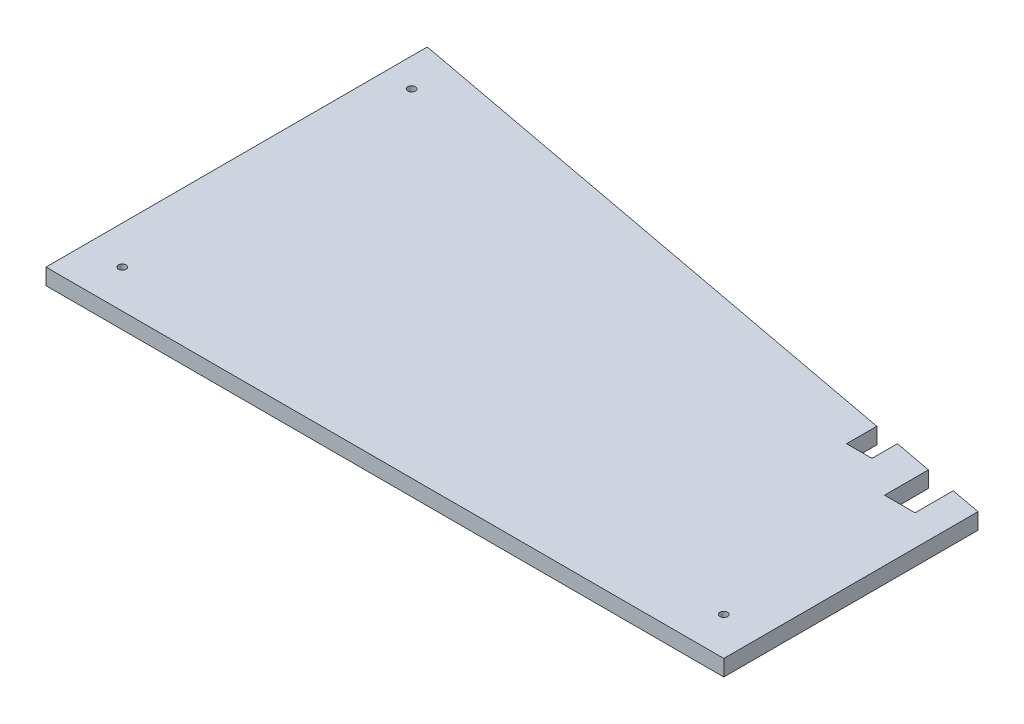
ISO-10303-21;
HEADER;
FILE_DESCRIPTION(('STEP AP214'),'2;1');
FILE_NAME('part.step','',(''),(''),'','','');
FILE_SCHEMA(('AUTOMOTIVE_DESIGN { 1 0 10303 214 1 1 1 1 }'));
ENDSEC;
DATA;
#1=APPLICATION_CONTEXT('core data for automotive mechanical design processes');
#2=APPLICATION_PROTOCOL_DEFINITION('international standard','automotive_design',2000,#1);
#3=PRODUCT_CONTEXT('',#1,'mechanical');
#4=PRODUCT('Part','Part','',(#3));
#5=PRODUCT_RELATED_PRODUCT_CATEGORY('part','',(#4));
#6=PRODUCT_DEFINITION_FORMATION('','',#4);
#7=PRODUCT_DEFINITION_CONTEXT('part definition',#1,'design');
#8=PRODUCT_DEFINITION('design','',#6,#7);
#9=PRODUCT_DEFINITION_SHAPE('','',#8);
#10=(LENGTH_UNIT() NAMED_UNIT(*) SI_UNIT(.MILLI.,.METRE.));
#11=(NAMED_UNIT(*) PLANE_ANGLE_UNIT() SI_UNIT($,.RADIAN.));
#12=(NAMED_UNIT(*) SI_UNIT($,.STERADIAN.) SOLID_ANGLE_UNIT());
#13=UNCERTAINTY_MEASURE_WITH_UNIT(LENGTH_MEASURE(1.E-05),#10,'distance_accuracy_value','');
#14=(GEOMETRIC_REPRESENTATION_CONTEXT(3) GLOBAL_UNCERTAINTY_ASSIGNED_CONTEXT((#13)) GLOBAL_UNIT_ASSIGNED_CONTEXT((#10,
#11,#12)) REPRESENTATION_CONTEXT('',''));
#15=CARTESIAN_POINT('',(0.,0.,0.));
#16=DIRECTION('',(0.,0.,1.));
#17=DIRECTION('',(1.,0.,0.));
#18=AXIS2_PLACEMENT_3D('',#15,#16,#17);
#19=CARTESIAN_POINT('',(0.,6.35,0.));
#20=DIRECTION('',(0.,1.,0.));
#21=DIRECTION('',(0.,0.,1.));
#22=AXIS2_PLACEMENT_3D('',#19,#20,#21);
#23=PLANE('',#22);
#24=CARTESIAN_POINT('',(15.,6.35,-15.));
#25=DIRECTION('',(0.,1.,0.));
#26=DIRECTION('',(0.,0.,1.));
#27=AXIS2_PLACEMENT_3D('',#24,#25,#26);
#28=CIRCLE('',#27,1.5);
#29=CARTESIAN_POINT('',(15.,6.35,-13.5));
#30=VERTEX_POINT('',#29);
#31=EDGE_CURVE('E327',#30,#30,#28,.T.);
#32=ORIENTED_EDGE('',*,*,#31,.F.);
#33=EDGE_LOOP('',(#32));
#34=FACE_BOUND('',#33,.T.);
#35=DIRECTION('',(0.,0.,1.));
#36=VECTOR('',#35,1.);
#37=CARTESIAN_POINT('',(0.,6.35,-150.));
#38=LINE('',#37,#36);
#39=CARTESIAN_POINT('',(0.,6.35,-150.));
#40=VERTEX_POINT('',#39);
#41=CARTESIAN_POINT('',(0.,6.35,0.));
#42=VERTEX_POINT('',#41);
#43=EDGE_CURVE('E200',#40,#42,#38,.T.);
#44=ORIENTED_EDGE('',*,*,#43,.T.);
#45=DIRECTION('',(1.,0.,0.));
#46=VECTOR('',#45,1.);
#47=CARTESIAN_POINT('',(0.,6.35,0.));
#48=LINE('',#47,#46);
#49=CARTESIAN_POINT('',(266.65,6.35,0.));
#50=VERTEX_POINT('',#49);
#51=EDGE_CURVE('E112',#42,#50,#48,.T.);
#52=ORIENTED_EDGE('',*,*,#51,.T.);
#53=DIRECTION('',(0.,0.,-1.));
#54=VECTOR('',#53,1.);
#55=CARTESIAN_POINT('',(266.65,6.35,0.));
#56=LINE('',#55,#54);
#57=CARTESIAN_POINT('',(266.65,6.35,-100.));
#58=VERTEX_POINT('',#57);
#59=EDGE_CURVE('E237',#50,#58,#56,.T.);
#60=ORIENTED_EDGE('',*,*,#59,.T.);
#61=DIRECTION('',(-0.982870100460058,0.,-0.184299662565171));
#62=VECTOR('',#61,1.);
#63=CARTESIAN_POINT('',(266.65,6.35,-100.));
#64=LINE('',#63,#62);
#65=CARTESIAN_POINT('',(254.65,6.35,-102.25014063379));
#66=VERTEX_POINT('',#65);
#67=EDGE_CURVE('E257',#58,#66,#64,.T.);
#68=ORIENTED_EDGE('',*,*,#67,.T.);
#69=DIRECTION('',(0.,0.,1.));
#70=VECTOR('',#69,1.);
#71=CARTESIAN_POINT('',(254.65,6.35,-87.2501406337896));
#72=LINE('',#71,#70);
#73=CARTESIAN_POINT('',(254.65,6.35,-87.2501406337896));
#74=VERTEX_POINT('',#73);
#75=EDGE_CURVE('E253',#66,#74,#72,.T.);
#76=ORIENTED_EDGE('',*,*,#75,.T.);
#77=DIRECTION('',(-0.999995760709284,0.,0.00291179729023164));
#78=VECTOR('',#77,1.);
#79=CARTESIAN_POINT('',(242.650050871489,6.35,-87.2151990663068));
#80=LINE('',#79,#78);
#81=CARTESIAN_POINT('',(242.650050871489,6.35,-87.2151990663068));
#82=VERTEX_POINT('',#81);
#83=EDGE_CURVE('E256',#74,#82,#80,.T.);
#84=ORIENTED_EDGE('',*,*,#83,.T.);
#85=DIRECTION('',(0.,0.,-1.));
#86=VECTOR('',#85,1.);
#87=CARTESIAN_POINT('',(242.650050871489,6.35,-104.500271728579));
#88=LINE('',#87,#86);
#89=CARTESIAN_POINT('',(242.650050871489,6.35,-104.500271728579));
#90=VERTEX_POINT('',#89);
#91=EDGE_CURVE('E261',#82,#90,#88,.T.);
#92=ORIENTED_EDGE('',*,*,#91,.T.);
#93=DIRECTION('',(-0.982870100460058,0.,-0.184299662565171));
#94=VECTOR('',#93,1.);
#95=CARTESIAN_POINT('',(242.650050871489,6.35,-104.500271728579));
#96=LINE('',#95,#94);
#97=CARTESIAN_POINT('',(227.650050871489,6.35,-107.312947520816));
#98=VERTEX_POINT('',#97);
#99=EDGE_CURVE('E268',#90,#98,#96,.T.);
#100=ORIENTED_EDGE('',*,*,#99,.T.);
#101=DIRECTION('',(0.,0.,1.));
#102=VECTOR('',#101,1.);
#103=CARTESIAN_POINT('',(227.650050871489,6.35,-97.3129475208159));
#104=LINE('',#103,#102);
#105=CARTESIAN_POINT('',(227.650050871489,6.35,-97.3129475208159));
#106=VERTEX_POINT('',#105);
#107=EDGE_CURVE('E143',#98,#106,#104,.T.);
#108=ORIENTED_EDGE('',*,*,#107,.T.);
#109=DIRECTION('',(-0.999995760709285,0.,0.00291179729023254));
#110=VECTOR('',#109,1.);
#111=CARTESIAN_POINT('',(227.650050871489,6.35,-97.3129475208159));
#112=LINE('',#111,#110);
#113=CARTESIAN_POINT('',(217.650050871489,6.35,-97.2838294244735));
#114=VERTEX_POINT('',#113);
#115=EDGE_CURVE('E137',#106,#114,#112,.T.);
#116=ORIENTED_EDGE('',*,*,#115,.T.);
#117=DIRECTION('',(0.,0.,-1.));
#118=VECTOR('',#117,1.);
#119=CARTESIAN_POINT('',(217.650050871489,6.35,-97.2838294244735));
#120=LINE('',#119,#118);
#121=CARTESIAN_POINT('',(217.650050871489,6.35,-109.188064715641));
#122=VERTEX_POINT('',#121);
#123=EDGE_CURVE('E141',#114,#122,#120,.T.);
#124=ORIENTED_EDGE('',*,*,#123,.T.);
#125=DIRECTION('',(-0.982870100460058,0.,-0.184299662565171));
#126=VECTOR('',#125,1.);
#127=CARTESIAN_POINT('',(217.650050871489,6.35,-109.188064715641));
#128=LINE('',#127,#126);
#129=EDGE_CURVE('E57',#122,#40,#128,.T.);
#130=ORIENTED_EDGE('',*,*,#129,.T.);
#131=EDGE_LOOP('',(#44,#52,#60,#68,#76,#84,#92,#100,#108,#116,#124,#130));
#132=FACE_BOUND('',#131,.T.);
#133=CARTESIAN_POINT('',(251.65,6.35,-15.));
#134=DIRECTION('',(0.,1.,0.));
#135=DIRECTION('',(0.,0.,1.));
#136=AXIS2_PLACEMENT_3D('',#133,#134,#135);
#137=CIRCLE('',#136,1.50000000000002);
#138=CARTESIAN_POINT('',(251.65,6.35,-13.5));
#139=VERTEX_POINT('',#138);
#140=EDGE_CURVE('E170',#139,#139,#137,.T.);
#141=ORIENTED_EDGE('',*,*,#140,.F.);
#142=EDGE_LOOP('',(#141));
#143=FACE_BOUND('',#142,.T.);
#144=CARTESIAN_POINT('',(11.1969277173947,6.35,-132.639018124475));
#145=DIRECTION('',(0.,1.,0.));
#146=DIRECTION('',(0.,0.,1.));
#147=AXIS2_PLACEMENT_3D('',#144,#145,#146);
#148=CIRCLE('',#147,1.5);
#149=CARTESIAN_POINT('',(11.1969277173947,6.35,-131.139018124475));
#150=VERTEX_POINT('',#149);
#151=EDGE_CURVE('E316',#150,#150,#148,.T.);
#152=ORIENTED_EDGE('',*,*,#151,.F.);
#153=EDGE_LOOP('',(#152));
#154=FACE_BOUND('',#153,.T.);
#155=ADVANCED_FACE('F39',(#34,#132,#143,#154),#23,.T.);
#156=CARTESIAN_POINT('',(0.,0.,0.));
#157=DIRECTION('',(0.,1.,0.));
#158=DIRECTION('',(0.,0.,1.));
#159=AXIS2_PLACEMENT_3D('',#156,#157,#158);
#160=PLANE('',#159);
#161=DIRECTION('',(0.,0.,1.));
#162=VECTOR('',#161,1.);
#163=CARTESIAN_POINT('',(0.,0.,-150.));
#164=LINE('',#163,#162);
#165=CARTESIAN_POINT('',(0.,0.,-150.));
#166=VERTEX_POINT('',#165);
#167=CARTESIAN_POINT('',(0.,0.,0.));
#168=VERTEX_POINT('',#167);
#169=EDGE_CURVE('E165',#166,#168,#164,.T.);
#170=ORIENTED_EDGE('',*,*,#169,.F.);
#171=DIRECTION('',(-0.982870100460058,0.,-0.184299662565171));
#172=VECTOR('',#171,1.);
#173=CARTESIAN_POINT('',(217.650050871489,0.,-109.188064715641));
#174=LINE('',#173,#172);
#175=CARTESIAN_POINT('',(217.650050871489,0.,-109.188064715641));
#176=VERTEX_POINT('',#175);
#177=EDGE_CURVE('E104',#176,#166,#174,.T.);
#178=ORIENTED_EDGE('',*,*,#177,.F.);
#179=DIRECTION('',(0.,0.,-1.));
#180=VECTOR('',#179,1.);
#181=CARTESIAN_POINT('',(217.650050871489,0.,-97.2838294244735));
#182=LINE('',#181,#180);
#183=CARTESIAN_POINT('',(217.650050871489,0.,-97.2838294244735));
#184=VERTEX_POINT('',#183);
#185=EDGE_CURVE('E98',#184,#176,#182,.T.);
#186=ORIENTED_EDGE('',*,*,#185,.F.);
#187=DIRECTION('',(-0.999995760709285,0.,0.00291179729023254));
#188=VECTOR('',#187,1.);
#189=CARTESIAN_POINT('',(227.650050871489,0.,-97.3129475208159));
#190=LINE('',#189,#188);
#191=CARTESIAN_POINT('',(227.650050871489,0.,-97.3129475208159));
#192=VERTEX_POINT('',#191);
#193=EDGE_CURVE('E152',#192,#184,#190,.T.);
#194=ORIENTED_EDGE('',*,*,#193,.F.);
#195=DIRECTION('',(0.,0.,1.));
#196=VECTOR('',#195,1.);
#197=CARTESIAN_POINT('',(227.650050871489,0.,-97.3129475208159));
#198=LINE('',#197,#196);
#199=CARTESIAN_POINT('',(227.650050871489,0.,-107.312947520816));
#200=VERTEX_POINT('',#199);
#201=EDGE_CURVE('E191',#200,#192,#198,.T.);
#202=ORIENTED_EDGE('',*,*,#201,.F.);
#203=DIRECTION('',(-0.982870100460058,0.,-0.184299662565171));
#204=VECTOR('',#203,1.);
#205=CARTESIAN_POINT('',(242.650050871489,0.,-104.500271728579));
#206=LINE('',#205,#204);
#207=CARTESIAN_POINT('',(242.650050871489,0.,-104.500271728579));
#208=VERTEX_POINT('',#207);
#209=EDGE_CURVE('E188',#208,#200,#206,.T.);
#210=ORIENTED_EDGE('',*,*,#209,.F.);
#211=DIRECTION('',(0.,0.,-1.));
#212=VECTOR('',#211,1.);
#213=CARTESIAN_POINT('',(242.650050871489,0.,-104.500271728579));
#214=LINE('',#213,#212);
#215=CARTESIAN_POINT('',(242.650050871489,0.,-87.2151990663068));
#216=VERTEX_POINT('',#215);
#217=EDGE_CURVE('E185',#216,#208,#214,.T.);
#218=ORIENTED_EDGE('',*,*,#217,.F.);
#219=DIRECTION('',(-0.999995760709284,0.,0.00291179729023164));
#220=VECTOR('',#219,1.);
#221=CARTESIAN_POINT('',(242.650050871489,0.,-87.2151990663068));
#222=LINE('',#221,#220);
#223=CARTESIAN_POINT('',(254.65,0.,-87.2501406337896));
#224=VERTEX_POINT('',#223);
#225=EDGE_CURVE('E182',#224,#216,#222,.T.);
#226=ORIENTED_EDGE('',*,*,#225,.F.);
#227=DIRECTION('',(0.,0.,1.));
#228=VECTOR('',#227,1.);
#229=CARTESIAN_POINT('',(254.65,0.,-87.2501406337896));
#230=LINE('',#229,#228);
#231=CARTESIAN_POINT('',(254.65,0.,-102.25014063379));
#232=VERTEX_POINT('',#231);
#233=EDGE_CURVE('E179',#232,#224,#230,.T.);
#234=ORIENTED_EDGE('',*,*,#233,.F.);
#235=DIRECTION('',(-0.982870100460058,0.,-0.184299662565171));
#236=VECTOR('',#235,1.);
#237=CARTESIAN_POINT('',(266.65,0.,-100.));
#238=LINE('',#237,#236);
#239=CARTESIAN_POINT('',(266.65,0.,-100.));
#240=VERTEX_POINT('',#239);
#241=EDGE_CURVE('E176',#240,#232,#238,.T.);
#242=ORIENTED_EDGE('',*,*,#241,.F.);
#243=DIRECTION('',(0.,0.,-1.));
#244=VECTOR('',#243,1.);
#245=CARTESIAN_POINT('',(266.65,0.,0.));
#246=LINE('',#245,#244);
#247=CARTESIAN_POINT('',(266.65,0.,0.));
#248=VERTEX_POINT('',#247);
#249=EDGE_CURVE('E173',#248,#240,#246,.T.);
#250=ORIENTED_EDGE('',*,*,#249,.F.);
#251=DIRECTION('',(1.,0.,0.));
#252=VECTOR('',#251,1.);
#253=CARTESIAN_POINT('',(0.,0.,0.));
#254=LINE('',#253,#252);
#255=EDGE_CURVE('E169',#168,#248,#254,.T.);
#256=ORIENTED_EDGE('',*,*,#255,.F.);
#257=EDGE_LOOP('',(#170,#178,#186,#194,#202,#210,#218,#226,#234,#242,#250,#256));
#258=FACE_BOUND('',#257,.T.);
#259=CARTESIAN_POINT('',(251.65,0.,-15.));
#260=DIRECTION('',(0.,1.,0.));
#261=DIRECTION('',(0.,0.,1.));
#262=AXIS2_PLACEMENT_3D('',#259,#260,#261);
#263=CIRCLE('',#262,1.50000000000002);
#264=CARTESIAN_POINT('',(251.65,0.,-13.5));
#265=VERTEX_POINT('',#264);
#266=EDGE_CURVE('E331',#265,#265,#263,.T.);
#267=ORIENTED_EDGE('',*,*,#266,.T.);
#268=EDGE_LOOP('',(#267));
#269=FACE_BOUND('',#268,.T.);
#270=CARTESIAN_POINT('',(15.,0.,-15.));
#271=DIRECTION('',(0.,1.,0.));
#272=DIRECTION('',(0.,0.,1.));
#273=AXIS2_PLACEMENT_3D('',#270,#271,#272);
#274=CIRCLE('',#273,1.5);
#275=CARTESIAN_POINT('',(15.,0.,-13.5));
#276=VERTEX_POINT('',#275);
#277=EDGE_CURVE('E324',#276,#276,#274,.T.);
#278=ORIENTED_EDGE('',*,*,#277,.T.);
#279=EDGE_LOOP('',(#278));
#280=FACE_BOUND('',#279,.T.);
#281=CARTESIAN_POINT('',(11.1969277173947,0.,-132.639018124475));
#282=DIRECTION('',(0.,1.,0.));
#283=DIRECTION('',(0.,0.,1.));
#284=AXIS2_PLACEMENT_3D('',#281,#282,#283);
#285=CIRCLE('',#284,1.5);
#286=CARTESIAN_POINT('',(11.1969277173947,0.,-131.139018124475));
#287=VERTEX_POINT('',#286);
#288=EDGE_CURVE('E319',#287,#287,#285,.T.);
#289=ORIENTED_EDGE('',*,*,#288,.T.);
#290=EDGE_LOOP('',(#289));
#291=FACE_BOUND('',#290,.T.);
#292=ADVANCED_FACE('F241',(#258,#269,#280,#291),#160,.F.);
#293=CARTESIAN_POINT('',(0.,6.35,-150.));
#294=DIRECTION('',(1.,0.,0.));
#295=DIRECTION('',(0.,0.,-1.));
#296=AXIS2_PLACEMENT_3D('',#293,#294,#295);
#297=PLANE('',#296);
#298=ORIENTED_EDGE('',*,*,#169,.T.);
#299=DIRECTION('',(0.,-1.,0.));
#300=VECTOR('',#299,1.);
#301=CARTESIAN_POINT('',(0.,6.35,0.));
#302=LINE('',#301,#300);
#303=EDGE_CURVE('E11',#42,#168,#302,.T.);
#304=ORIENTED_EDGE('',*,*,#303,.F.);
#305=ORIENTED_EDGE('',*,*,#43,.F.);
#306=DIRECTION('',(0.,-1.,0.));
#307=VECTOR('',#306,1.);
#308=CARTESIAN_POINT('',(0.,6.35,-150.));
#309=LINE('',#308,#307);
#310=EDGE_CURVE('E161',#40,#166,#309,.T.);
#311=ORIENTED_EDGE('',*,*,#310,.T.);
#312=EDGE_LOOP('',(#298,#304,#305,#311));
#313=FACE_BOUND('',#312,.T.);
#314=ADVANCED_FACE('F41',(#313),#297,.F.);
#315=CARTESIAN_POINT('',(0.,6.35,0.));
#316=DIRECTION('',(0.,0.,-1.));
#317=DIRECTION('',(-1.,0.,0.));
#318=AXIS2_PLACEMENT_3D('',#315,#316,#317);
#319=PLANE('',#318);
#320=ORIENTED_EDGE('',*,*,#255,.T.);
#321=DIRECTION('',(0.,-1.,0.));
#322=VECTOR('',#321,1.);
#323=CARTESIAN_POINT('',(266.65,6.35,0.));
#324=LINE('',#323,#322);
#325=EDGE_CURVE('E49',#50,#248,#324,.T.);
#326=ORIENTED_EDGE('',*,*,#325,.F.);
#327=ORIENTED_EDGE('',*,*,#51,.F.);
#328=ORIENTED_EDGE('',*,*,#303,.T.);
#329=EDGE_LOOP('',(#320,#326,#327,#328));
#330=FACE_BOUND('',#329,.T.);
#331=ADVANCED_FACE('F439',(#330),#319,.F.);
#332=CARTESIAN_POINT('',(266.65,6.35,0.));
#333=DIRECTION('',(-1.,0.,0.));
#334=DIRECTION('',(0.,0.,1.));
#335=AXIS2_PLACEMENT_3D('',#332,#333,#334);
#336=PLANE('',#335);
#337=ORIENTED_EDGE('',*,*,#249,.T.);
#338=DIRECTION('',(0.,-1.,0.));
#339=VECTOR('',#338,1.);
#340=CARTESIAN_POINT('',(266.65,6.35,-100.));
#341=LINE('',#340,#339);
#342=EDGE_CURVE('E227',#58,#240,#341,.T.);
#343=ORIENTED_EDGE('',*,*,#342,.F.);
#344=ORIENTED_EDGE('',*,*,#59,.F.);
#345=ORIENTED_EDGE('',*,*,#325,.T.);
#346=EDGE_LOOP('',(#337,#343,#344,#345));
#347=FACE_BOUND('',#346,.T.);
#348=ADVANCED_FACE('F235',(#347),#336,.F.);
#349=CARTESIAN_POINT('',(266.65,6.35,-100.));
#350=DIRECTION('',(-0.184299662565171,0.,0.982870100460058));
#351=DIRECTION('',(0.982870100460058,0.,0.184299662565171));
#352=AXIS2_PLACEMENT_3D('',#349,#350,#351);
#353=PLANE('',#352);
#354=ORIENTED_EDGE('',*,*,#241,.T.);
#355=DIRECTION('',(0.,-1.,0.));
#356=VECTOR('',#355,1.);
#357=CARTESIAN_POINT('',(254.65,6.35,-102.25014063379));
#358=LINE('',#357,#356);
#359=EDGE_CURVE('E223',#66,#232,#358,.T.);
#360=ORIENTED_EDGE('',*,*,#359,.F.);
#361=ORIENTED_EDGE('',*,*,#67,.F.);
#362=ORIENTED_EDGE('',*,*,#342,.T.);
#363=EDGE_LOOP('',(#354,#360,#361,#362));
#364=FACE_BOUND('',#363,.T.);
#365=ADVANCED_FACE('F247',(#364),#353,.F.);
#366=CARTESIAN_POINT('',(254.65,6.35,-87.2501406337896));
#367=DIRECTION('',(1.,0.,0.));
#368=DIRECTION('',(0.,0.,-1.));
#369=AXIS2_PLACEMENT_3D('',#366,#367,#368);
#370=PLANE('',#369);
#371=ORIENTED_EDGE('',*,*,#233,.T.);
#372=DIRECTION('',(0.,-1.,0.));
#373=VECTOR('',#372,1.);
#374=CARTESIAN_POINT('',(254.65,6.35,-87.2501406337896));
#375=LINE('',#374,#373);
#376=EDGE_CURVE('E219',#74,#224,#375,.T.);
#377=ORIENTED_EDGE('',*,*,#376,.F.);
#378=ORIENTED_EDGE('',*,*,#75,.F.);
#379=ORIENTED_EDGE('',*,*,#359,.T.);
#380=EDGE_LOOP('',(#371,#377,#378,#379));
#381=FACE_BOUND('',#380,.T.);
#382=ADVANCED_FACE('F251',(#381),#370,.F.);
#383=CARTESIAN_POINT('',(242.650050871489,6.35,-87.2151990663068));
#384=DIRECTION('',(0.00291179729023164,0.,0.999995760709284));
#385=DIRECTION('',(0.999995760709285,0.,-0.00291179729023164));
#386=AXIS2_PLACEMENT_3D('',#383,#384,#385);
#387=PLANE('',#386);
#388=ORIENTED_EDGE('',*,*,#225,.T.);
#389=DIRECTION('',(0.,-1.,0.));
#390=VECTOR('',#389,1.);
#391=CARTESIAN_POINT('',(242.650050871489,6.35,-87.2151990663068));
#392=LINE('',#391,#390);
#393=EDGE_CURVE('E215',#82,#216,#392,.T.);
#394=ORIENTED_EDGE('',*,*,#393,.F.);
#395=ORIENTED_EDGE('',*,*,#83,.F.);
#396=ORIENTED_EDGE('',*,*,#376,.T.);
#397=EDGE_LOOP('',(#388,#394,#395,#396));
#398=FACE_BOUND('',#397,.T.);
#399=ADVANCED_FACE('F404',(#398),#387,.F.);
#400=CARTESIAN_POINT('',(242.650050871489,6.35,-104.500271728579));
#401=DIRECTION('',(-1.,0.,0.));
#402=DIRECTION('',(0.,0.,1.));
#403=AXIS2_PLACEMENT_3D('',#400,#401,#402);
#404=PLANE('',#403);
#405=ORIENTED_EDGE('',*,*,#217,.T.);
#406=DIRECTION('',(0.,-1.,0.));
#407=VECTOR('',#406,1.);
#408=CARTESIAN_POINT('',(242.650050871489,6.35,-104.500271728579));
#409=LINE('',#408,#407);
#410=EDGE_CURVE('E211',#90,#208,#409,.T.);
#411=ORIENTED_EDGE('',*,*,#410,.F.);
#412=ORIENTED_EDGE('',*,*,#91,.F.);
#413=ORIENTED_EDGE('',*,*,#393,.T.);
#414=EDGE_LOOP('',(#405,#411,#412,#413));
#415=FACE_BOUND('',#414,.T.);
#416=ADVANCED_FACE('F395',(#415),#404,.F.);
#417=CARTESIAN_POINT('',(242.650050871489,6.35,-104.500271728579));
#418=DIRECTION('',(-0.184299662565171,0.,0.982870100460058));
#419=DIRECTION('',(0.982870100460058,0.,0.184299662565171));
#420=AXIS2_PLACEMENT_3D('',#417,#418,#419);
#421=PLANE('',#420);
#422=ORIENTED_EDGE('',*,*,#209,.T.);
#423=DIRECTION('',(0.,-1.,0.));
#424=VECTOR('',#423,1.);
#425=CARTESIAN_POINT('',(227.650050871489,6.35,-107.312947520816));
#426=LINE('',#425,#424);
#427=EDGE_CURVE('E207',#98,#200,#426,.T.);
#428=ORIENTED_EDGE('',*,*,#427,.F.);
#429=ORIENTED_EDGE('',*,*,#99,.F.);
#430=ORIENTED_EDGE('',*,*,#410,.T.);
#431=EDGE_LOOP('',(#422,#428,#429,#430));
#432=FACE_BOUND('',#431,.T.);
#433=ADVANCED_FACE('F276',(#432),#421,.F.);
#434=CARTESIAN_POINT('',(227.650050871489,6.35,-97.3129475208159));
#435=DIRECTION('',(1.,0.,0.));
#436=DIRECTION('',(0.,0.,-1.));
#437=AXIS2_PLACEMENT_3D('',#434,#435,#436);
#438=PLANE('',#437);
#439=ORIENTED_EDGE('',*,*,#201,.T.);
#440=DIRECTION('',(0.,-1.,0.));
#441=VECTOR('',#440,1.);
#442=CARTESIAN_POINT('',(227.650050871489,6.35,-97.3129475208159));
#443=LINE('',#442,#441);
#444=EDGE_CURVE('E154',#106,#192,#443,.T.);
#445=ORIENTED_EDGE('',*,*,#444,.F.);
#446=ORIENTED_EDGE('',*,*,#107,.F.);
#447=ORIENTED_EDGE('',*,*,#427,.T.);
#448=EDGE_LOOP('',(#439,#445,#446,#447));
#449=FACE_BOUND('',#448,.T.);
#450=ADVANCED_FACE('F280',(#449),#438,.F.);
#451=CARTESIAN_POINT('',(227.650050871489,6.35,-97.3129475208159));
#452=DIRECTION('',(0.00291179729023254,0.,0.999995760709285));
#453=DIRECTION('',(0.999995760709285,0.,-0.00291179729023254));
#454=AXIS2_PLACEMENT_3D('',#451,#452,#453);
#455=PLANE('',#454);
#456=ORIENTED_EDGE('',*,*,#193,.T.);
#457=DIRECTION('',(0.,-1.,0.));
#458=VECTOR('',#457,1.);
#459=CARTESIAN_POINT('',(217.650050871489,6.35,-97.2838294244735));
#460=LINE('',#459,#458);
#461=EDGE_CURVE('E149',#114,#184,#460,.T.);
#462=ORIENTED_EDGE('',*,*,#461,.F.);
#463=ORIENTED_EDGE('',*,*,#115,.F.);
#464=ORIENTED_EDGE('',*,*,#444,.T.);
#465=EDGE_LOOP('',(#456,#462,#463,#464));
#466=FACE_BOUND('',#465,.T.);
#467=ADVANCED_FACE('F150',(#466),#455,.F.);
#468=CARTESIAN_POINT('',(217.650050871489,6.35,-97.2838294244735));
#469=DIRECTION('',(-1.,0.,0.));
#470=DIRECTION('',(0.,0.,1.));
#471=AXIS2_PLACEMENT_3D('',#468,#469,#470);
#472=PLANE('',#471);
#473=ORIENTED_EDGE('',*,*,#185,.T.);
#474=DIRECTION('',(0.,-1.,0.));
#475=VECTOR('',#474,1.);
#476=CARTESIAN_POINT('',(217.650050871489,6.35,-109.188064715641));
#477=LINE('',#476,#475);
#478=EDGE_CURVE('E155',#122,#176,#477,.T.);
#479=ORIENTED_EDGE('',*,*,#478,.F.);
#480=ORIENTED_EDGE('',*,*,#123,.F.);
#481=ORIENTED_EDGE('',*,*,#461,.T.);
#482=EDGE_LOOP('',(#473,#479,#480,#481));
#483=FACE_BOUND('',#482,.T.);
#484=ADVANCED_FACE('F157',(#483),#472,.F.);
#485=CARTESIAN_POINT('',(217.650050871489,6.35,-109.188064715641));
#486=DIRECTION('',(-0.184299662565171,0.,0.982870100460058));
#487=DIRECTION('',(0.982870100460058,0.,0.184299662565171));
#488=AXIS2_PLACEMENT_3D('',#485,#486,#487);
#489=PLANE('',#488);
#490=ORIENTED_EDGE('',*,*,#177,.T.);
#491=ORIENTED_EDGE('',*,*,#310,.F.);
#492=ORIENTED_EDGE('',*,*,#129,.F.);
#493=ORIENTED_EDGE('',*,*,#478,.T.);
#494=EDGE_LOOP('',(#490,#491,#492,#493));
#495=FACE_BOUND('',#494,.T.);
#496=ADVANCED_FACE('F284',(#495),#489,.F.);
#497=CARTESIAN_POINT('',(251.65,6.35,-15.));
#498=DIRECTION('',(0.,-1.,0.));
#499=DIRECTION('',(0.,0.,-1.));
#500=AXIS2_PLACEMENT_3D('',#497,#498,#499);
#501=CYLINDRICAL_SURFACE('',#500,1.50000000000002);
#502=ORIENTED_EDGE('',*,*,#140,.T.);
#503=EDGE_LOOP('',(#502));
#504=FACE_BOUND('',#503,.T.);
#505=ORIENTED_EDGE('',*,*,#266,.F.);
#506=EDGE_LOOP('',(#505));
#507=FACE_BOUND('',#506,.T.);
#508=ADVANCED_FACE('F286',(#504,#507),#501,.F.);
#509=CARTESIAN_POINT('',(15.,6.35,-15.));
#510=DIRECTION('',(0.,-1.,0.));
#511=DIRECTION('',(0.,0.,-1.));
#512=AXIS2_PLACEMENT_3D('',#509,#510,#511);
#513=CYLINDRICAL_SURFACE('',#512,1.5);
#514=ORIENTED_EDGE('',*,*,#31,.T.);
#515=EDGE_LOOP('',(#514));
#516=FACE_BOUND('',#515,.T.);
#517=ORIENTED_EDGE('',*,*,#277,.F.);
#518=EDGE_LOOP('',(#517));
#519=FACE_BOUND('',#518,.T.);
#520=ADVANCED_FACE('F292',(#516,#519),#513,.F.);
#521=CARTESIAN_POINT('',(11.1969277173947,6.35,-132.639018124475));
#522=DIRECTION('',(0.,-1.,0.));
#523=DIRECTION('',(0.,0.,-1.));
#524=AXIS2_PLACEMENT_3D('',#521,#522,#523);
#525=CYLINDRICAL_SURFACE('',#524,1.5);
#526=ORIENTED_EDGE('',*,*,#151,.T.);
#527=EDGE_LOOP('',(#526));
#528=FACE_BOUND('',#527,.T.);
#529=ORIENTED_EDGE('',*,*,#288,.F.);
#530=EDGE_LOOP('',(#529));
#531=FACE_BOUND('',#530,.T.);
#532=ADVANCED_FACE('F307',(#528,#531),#525,.F.);
#533=CLOSED_SHELL('',(#155,#292,#314,#331,#348,#365,#382,#399,#416,#433,#450,#467,#484,#496,
#508,#520,#532));
#534=MANIFOLD_SOLID_BREP('B2',#533);
#535=ADVANCED_BREP_SHAPE_REPRESENTATION('',(#18,#534),#14);
#536=SHAPE_DEFINITION_REPRESENTATION(#9,#535);
ENDSEC;
END-ISO-10303-21;
